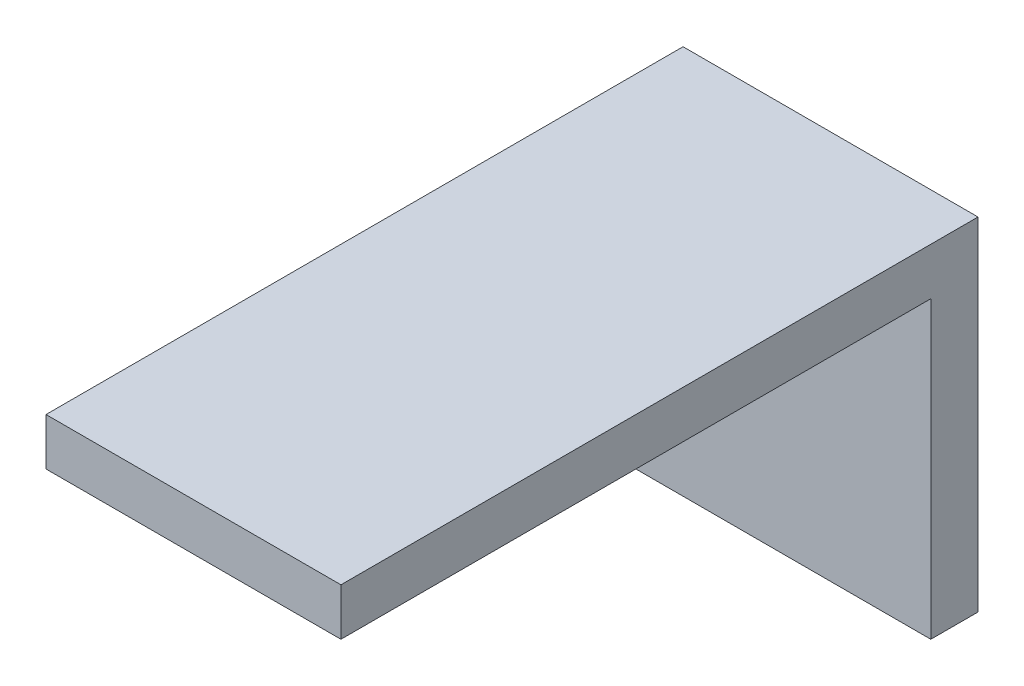
ISO-10303-21;
HEADER;
FILE_DESCRIPTION(('STEP AP214'),'2;1');
FILE_NAME('part.step','',(''),(''),'','','');
FILE_SCHEMA(('AUTOMOTIVE_DESIGN { 1 0 10303 214 1 1 1 1 }'));
ENDSEC;
DATA;
#1=APPLICATION_CONTEXT('core data for automotive mechanical design processes');
#2=APPLICATION_PROTOCOL_DEFINITION('international standard','automotive_design',2000,#1);
#3=PRODUCT_CONTEXT('',#1,'mechanical');
#4=PRODUCT('Part','Part','',(#3));
#5=PRODUCT_RELATED_PRODUCT_CATEGORY('part','',(#4));
#6=PRODUCT_DEFINITION_FORMATION('','',#4);
#7=PRODUCT_DEFINITION_CONTEXT('part definition',#1,'design');
#8=PRODUCT_DEFINITION('design','',#6,#7);
#9=PRODUCT_DEFINITION_SHAPE('','',#8);
#10=(LENGTH_UNIT() NAMED_UNIT(*) SI_UNIT(.MILLI.,.METRE.));
#11=(NAMED_UNIT(*) PLANE_ANGLE_UNIT() SI_UNIT($,.RADIAN.));
#12=(NAMED_UNIT(*) SI_UNIT($,.STERADIAN.) SOLID_ANGLE_UNIT());
#13=UNCERTAINTY_MEASURE_WITH_UNIT(LENGTH_MEASURE(1.E-05),#10,'distance_accuracy_value','');
#14=(GEOMETRIC_REPRESENTATION_CONTEXT(3) GLOBAL_UNCERTAINTY_ASSIGNED_CONTEXT((#13)) GLOBAL_UNIT_ASSIGNED_CONTEXT((#10,
#11,#12)) REPRESENTATION_CONTEXT('',''));
#15=CARTESIAN_POINT('',(0.,0.,0.));
#16=DIRECTION('',(0.,0.,1.));
#17=DIRECTION('',(1.,0.,0.));
#18=AXIS2_PLACEMENT_3D('',#15,#16,#17);
#19=CARTESIAN_POINT('',(12.5,0.,0.));
#20=DIRECTION('',(0.,1.,0.));
#21=DIRECTION('',(0.,0.,1.));
#22=AXIS2_PLACEMENT_3D('',#19,#20,#21);
#23=PLANE('',#22);
#24=DIRECTION('',(0.,0.,-1.));
#25=VECTOR('',#24,1.);
#26=CARTESIAN_POINT('',(-12.5,0.,0.));
#27=LINE('',#26,#25);
#28=CARTESIAN_POINT('',(-12.5,0.,50.));
#29=VERTEX_POINT('',#28);
#30=CARTESIAN_POINT('',(-12.5,0.,0.));
#31=VERTEX_POINT('',#30);
#32=EDGE_CURVE('E128',#29,#31,#27,.T.);
#33=ORIENTED_EDGE('',*,*,#32,.T.);
#34=DIRECTION('',(-1.,0.,0.));
#35=VECTOR('',#34,1.);
#36=CARTESIAN_POINT('',(12.5,0.,0.));
#37=LINE('',#36,#35);
#38=CARTESIAN_POINT('',(12.5,0.,0.));
#39=VERTEX_POINT('',#38);
#40=EDGE_CURVE('E11',#39,#31,#37,.T.);
#41=ORIENTED_EDGE('',*,*,#40,.F.);
#42=DIRECTION('',(0.,0.,-1.));
#43=VECTOR('',#42,1.);
#44=CARTESIAN_POINT('',(12.5,0.,0.));
#45=LINE('',#44,#43);
#46=CARTESIAN_POINT('',(12.5,0.,50.));
#47=VERTEX_POINT('',#46);
#48=EDGE_CURVE('E144',#47,#39,#45,.T.);
#49=ORIENTED_EDGE('',*,*,#48,.F.);
#50=DIRECTION('',(-1.,0.,0.));
#51=VECTOR('',#50,1.);
#52=CARTESIAN_POINT('',(12.5,0.,50.));
#53=LINE('',#52,#51);
#54=EDGE_CURVE('E124',#47,#29,#53,.T.);
#55=ORIENTED_EDGE('',*,*,#54,.T.);
#56=EDGE_LOOP('',(#33,#41,#49,#55));
#57=FACE_BOUND('',#56,.T.);
#58=ADVANCED_FACE('F39',(#57),#23,.F.);
#59=CARTESIAN_POINT('',(12.5,0.,0.));
#60=DIRECTION('',(0.,0.,-1.));
#61=DIRECTION('',(0.,1.,0.));
#62=AXIS2_PLACEMENT_3D('',#59,#60,#61);
#63=PLANE('',#62);
#64=DIRECTION('',(0.,-1.,0.));
#65=VECTOR('',#64,1.);
#66=CARTESIAN_POINT('',(-12.5,0.,0.));
#67=LINE('',#66,#65);
#68=CARTESIAN_POINT('',(-12.5,-25.,0.));
#69=VERTEX_POINT('',#68);
#70=EDGE_CURVE('E132',#31,#69,#67,.T.);
#71=ORIENTED_EDGE('',*,*,#70,.T.);
#72=DIRECTION('',(-1.,0.,0.));
#73=VECTOR('',#72,1.);
#74=CARTESIAN_POINT('',(12.5,-25.,0.));
#75=LINE('',#74,#73);
#76=CARTESIAN_POINT('',(12.5,-25.,0.));
#77=VERTEX_POINT('',#76);
#78=EDGE_CURVE('E48',#77,#69,#75,.T.);
#79=ORIENTED_EDGE('',*,*,#78,.F.);
#80=DIRECTION('',(0.,-1.,0.));
#81=VECTOR('',#80,1.);
#82=CARTESIAN_POINT('',(12.5,0.,0.));
#83=LINE('',#82,#81);
#84=EDGE_CURVE('E93',#39,#77,#83,.T.);
#85=ORIENTED_EDGE('',*,*,#84,.F.);
#86=ORIENTED_EDGE('',*,*,#40,.T.);
#87=EDGE_LOOP('',(#71,#79,#85,#86));
#88=FACE_BOUND('',#87,.T.);
#89=ADVANCED_FACE('F172',(#88),#63,.F.);
#90=CARTESIAN_POINT('',(12.5,-25.,0.));
#91=DIRECTION('',(0.,1.,0.));
#92=DIRECTION('',(0.,0.,1.));
#93=AXIS2_PLACEMENT_3D('',#90,#91,#92);
#94=PLANE('',#93);
#95=DIRECTION('',(0.,0.,-1.));
#96=VECTOR('',#95,1.);
#97=CARTESIAN_POINT('',(-12.5,-25.,0.));
#98=LINE('',#97,#96);
#99=CARTESIAN_POINT('',(-12.5,-25.,-4.00000000000001));
#100=VERTEX_POINT('',#99);
#101=EDGE_CURVE('E135',#69,#100,#98,.T.);
#102=ORIENTED_EDGE('',*,*,#101,.T.);
#103=DIRECTION('',(-1.,0.,0.));
#104=VECTOR('',#103,1.);
#105=CARTESIAN_POINT('',(12.5,-25.,-4.00000000000001));
#106=LINE('',#105,#104);
#107=CARTESIAN_POINT('',(12.5,-25.,-4.00000000000001));
#108=VERTEX_POINT('',#107);
#109=EDGE_CURVE('E117',#108,#100,#106,.T.);
#110=ORIENTED_EDGE('',*,*,#109,.F.);
#111=DIRECTION('',(0.,0.,-1.));
#112=VECTOR('',#111,1.);
#113=CARTESIAN_POINT('',(12.5,-25.,0.));
#114=LINE('',#113,#112);
#115=EDGE_CURVE('E106',#77,#108,#114,.T.);
#116=ORIENTED_EDGE('',*,*,#115,.F.);
#117=ORIENTED_EDGE('',*,*,#78,.T.);
#118=EDGE_LOOP('',(#102,#110,#116,#117));
#119=FACE_BOUND('',#118,.T.);
#120=ADVANCED_FACE('F154',(#119),#94,.F.);
#121=CARTESIAN_POINT('',(12.5,-25.,-4.00000000000001));
#122=DIRECTION('',(0.,0.,1.));
#123=DIRECTION('',(0.,-1.,0.));
#124=AXIS2_PLACEMENT_3D('',#121,#122,#123);
#125=PLANE('',#124);
#126=DIRECTION('',(0.,1.,0.));
#127=VECTOR('',#126,1.);
#128=CARTESIAN_POINT('',(-12.5,-25.,-4.00000000000001));
#129=LINE('',#128,#127);
#130=CARTESIAN_POINT('',(-12.5,4.00000000000001,-3.99999999999999));
#131=VERTEX_POINT('',#130);
#132=EDGE_CURVE('E115',#100,#131,#129,.T.);
#133=ORIENTED_EDGE('',*,*,#132,.T.);
#134=DIRECTION('',(-1.,0.,0.));
#135=VECTOR('',#134,1.);
#136=CARTESIAN_POINT('',(12.5,4.00000000000001,-3.99999999999999));
#137=LINE('',#136,#135);
#138=CARTESIAN_POINT('',(12.5,4.00000000000001,-3.99999999999999));
#139=VERTEX_POINT('',#138);
#140=EDGE_CURVE('E112',#139,#131,#137,.T.);
#141=ORIENTED_EDGE('',*,*,#140,.F.);
#142=DIRECTION('',(0.,1.,0.));
#143=VECTOR('',#142,1.);
#144=CARTESIAN_POINT('',(12.5,-25.,-4.00000000000001));
#145=LINE('',#144,#143);
#146=EDGE_CURVE('E100',#108,#139,#145,.T.);
#147=ORIENTED_EDGE('',*,*,#146,.F.);
#148=ORIENTED_EDGE('',*,*,#109,.T.);
#149=EDGE_LOOP('',(#133,#141,#147,#148));
#150=FACE_BOUND('',#149,.T.);
#151=ADVANCED_FACE('F113',(#150),#125,.F.);
#152=CARTESIAN_POINT('',(12.5,3.99999999999998,50.));
#153=DIRECTION('',(0.,-1.,0.));
#154=DIRECTION('',(0.,0.,-1.));
#155=AXIS2_PLACEMENT_3D('',#152,#153,#154);
#156=PLANE('',#155);
#157=DIRECTION('',(0.,0.,1.));
#158=VECTOR('',#157,1.);
#159=CARTESIAN_POINT('',(-12.5,3.99999999999998,50.));
#160=LINE('',#159,#158);
#161=CARTESIAN_POINT('',(-12.5,3.99999999999998,50.));
#162=VERTEX_POINT('',#161);
#163=EDGE_CURVE('E79',#131,#162,#160,.T.);
#164=ORIENTED_EDGE('',*,*,#163,.T.);
#165=DIRECTION('',(-1.,0.,0.));
#166=VECTOR('',#165,1.);
#167=CARTESIAN_POINT('',(12.5,3.99999999999998,50.));
#168=LINE('',#167,#166);
#169=CARTESIAN_POINT('',(12.5,3.99999999999998,50.));
#170=VERTEX_POINT('',#169);
#171=EDGE_CURVE('E118',#170,#162,#168,.T.);
#172=ORIENTED_EDGE('',*,*,#171,.F.);
#173=DIRECTION('',(0.,0.,1.));
#174=VECTOR('',#173,1.);
#175=CARTESIAN_POINT('',(12.5,3.99999999999998,50.));
#176=LINE('',#175,#174);
#177=EDGE_CURVE('E104',#139,#170,#176,.T.);
#178=ORIENTED_EDGE('',*,*,#177,.F.);
#179=ORIENTED_EDGE('',*,*,#140,.T.);
#180=EDGE_LOOP('',(#164,#172,#178,#179));
#181=FACE_BOUND('',#180,.T.);
#182=ADVANCED_FACE('F120',(#181),#156,.F.);
#183=CARTESIAN_POINT('',(12.5,0.,50.));
#184=DIRECTION('',(0.,0.,-1.));
#185=DIRECTION('',(-1.,0.,0.));
#186=AXIS2_PLACEMENT_3D('',#183,#184,#185);
#187=PLANE('',#186);
#188=DIRECTION('',(0.,-1.,0.));
#189=VECTOR('',#188,1.);
#190=CARTESIAN_POINT('',(-12.5,0.,50.));
#191=LINE('',#190,#189);
#192=EDGE_CURVE('E85',#162,#29,#191,.T.);
#193=ORIENTED_EDGE('',*,*,#192,.T.);
#194=ORIENTED_EDGE('',*,*,#54,.F.);
#195=DIRECTION('',(0.,-1.,0.));
#196=VECTOR('',#195,1.);
#197=CARTESIAN_POINT('',(12.5,0.,50.));
#198=LINE('',#197,#196);
#199=EDGE_CURVE('E56',#170,#47,#198,.T.);
#200=ORIENTED_EDGE('',*,*,#199,.F.);
#201=ORIENTED_EDGE('',*,*,#171,.T.);
#202=EDGE_LOOP('',(#193,#194,#200,#201));
#203=FACE_BOUND('',#202,.T.);
#204=ADVANCED_FACE('F161',(#203),#187,.F.);
#205=CARTESIAN_POINT('',(12.5,0.,0.));
#206=DIRECTION('',(-1.,0.,0.));
#207=DIRECTION('',(0.,0.,1.));
#208=AXIS2_PLACEMENT_3D('',#205,#206,#207);
#209=PLANE('',#208);
#210=ORIENTED_EDGE('',*,*,#48,.T.);
#211=ORIENTED_EDGE('',*,*,#84,.T.);
#212=ORIENTED_EDGE('',*,*,#115,.T.);
#213=ORIENTED_EDGE('',*,*,#146,.T.);
#214=ORIENTED_EDGE('',*,*,#177,.T.);
#215=ORIENTED_EDGE('',*,*,#199,.T.);
#216=EDGE_LOOP('',(#210,#211,#212,#213,#214,#215));
#217=FACE_BOUND('',#216,.T.);
#218=ADVANCED_FACE('F102',(#217),#209,.F.);
#219=CARTESIAN_POINT('',(-12.5,0.,0.));
#220=DIRECTION('',(-1.,0.,0.));
#221=DIRECTION('',(0.,0.,1.));
#222=AXIS2_PLACEMENT_3D('',#219,#220,#221);
#223=PLANE('',#222);
#224=ORIENTED_EDGE('',*,*,#32,.F.);
#225=ORIENTED_EDGE('',*,*,#192,.F.);
#226=ORIENTED_EDGE('',*,*,#163,.F.);
#227=ORIENTED_EDGE('',*,*,#132,.F.);
#228=ORIENTED_EDGE('',*,*,#101,.F.);
#229=ORIENTED_EDGE('',*,*,#70,.F.);
#230=EDGE_LOOP('',(#224,#225,#226,#227,#228,#229));
#231=FACE_BOUND('',#230,.T.);
#232=ADVANCED_FACE('F157',(#231),#223,.T.);
#233=CLOSED_SHELL('',(#58,#89,#120,#151,#182,#204,#218,#232));
#234=MANIFOLD_SOLID_BREP('B2',#233);
#235=ADVANCED_BREP_SHAPE_REPRESENTATION('',(#18,#234),#14);
#236=SHAPE_DEFINITION_REPRESENTATION(#9,#235);
ENDSEC;
END-ISO-10303-21;
